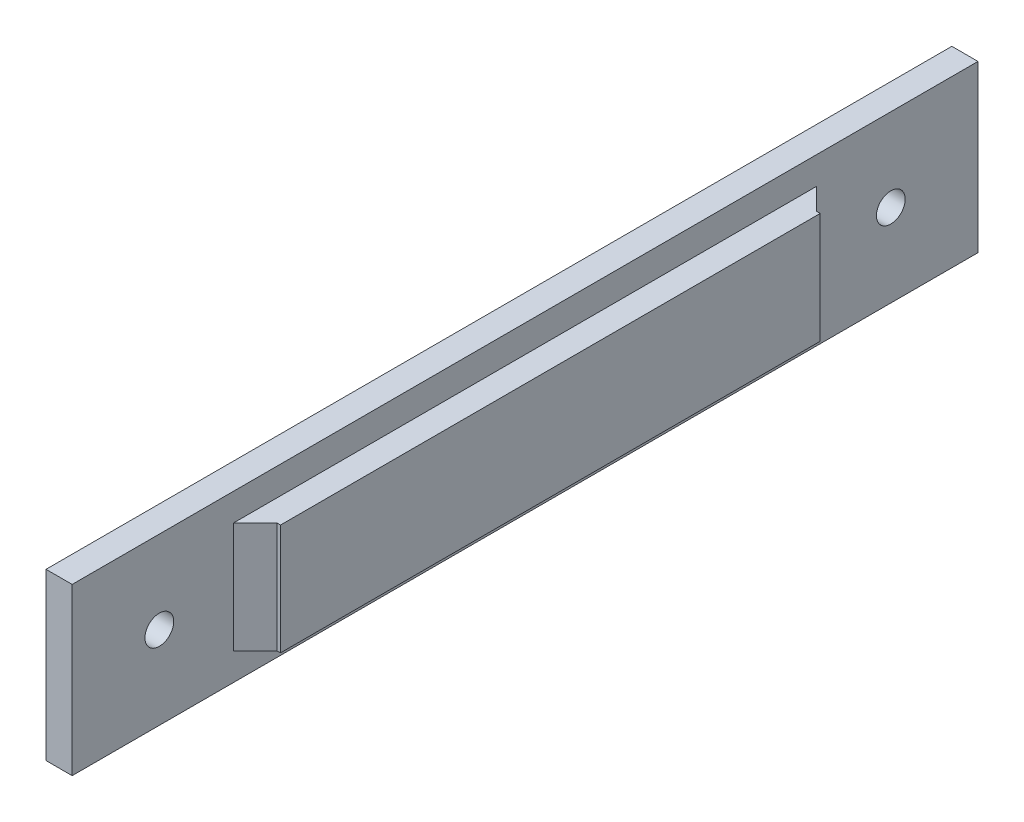
ISO-10303-21;
HEADER;
FILE_DESCRIPTION(('STEP AP214'),'2;1');
FILE_NAME('part.step','',(''),(''),'','','');
FILE_SCHEMA(('AUTOMOTIVE_DESIGN { 1 0 10303 214 1 1 1 1 }'));
ENDSEC;
DATA;
#1=APPLICATION_CONTEXT('core data for automotive mechanical design processes');
#2=APPLICATION_PROTOCOL_DEFINITION('international standard','automotive_design',2000,#1);
#3=PRODUCT_CONTEXT('',#1,'mechanical');
#4=PRODUCT('Part','Part','',(#3));
#5=PRODUCT_RELATED_PRODUCT_CATEGORY('part','',(#4));
#6=PRODUCT_DEFINITION_FORMATION('','',#4);
#7=PRODUCT_DEFINITION_CONTEXT('part definition',#1,'design');
#8=PRODUCT_DEFINITION('design','',#6,#7);
#9=PRODUCT_DEFINITION_SHAPE('','',#8);
#10=(LENGTH_UNIT() NAMED_UNIT(*) SI_UNIT(.MILLI.,.METRE.));
#11=(NAMED_UNIT(*) PLANE_ANGLE_UNIT() SI_UNIT($,.RADIAN.));
#12=(NAMED_UNIT(*) SI_UNIT($,.STERADIAN.) SOLID_ANGLE_UNIT());
#13=UNCERTAINTY_MEASURE_WITH_UNIT(LENGTH_MEASURE(1.E-05),#10,'distance_accuracy_value','');
#14=(GEOMETRIC_REPRESENTATION_CONTEXT(3) GLOBAL_UNCERTAINTY_ASSIGNED_CONTEXT((#13)) GLOBAL_UNIT_ASSIGNED_CONTEXT((#10,
#11,#12)) REPRESENTATION_CONTEXT('',''));
#15=CARTESIAN_POINT('',(0.,0.,0.));
#16=DIRECTION('',(0.,0.,1.));
#17=DIRECTION('',(1.,0.,0.));
#18=AXIS2_PLACEMENT_3D('',#15,#16,#17);
#19=CARTESIAN_POINT('',(0.,0.,103.9));
#20=DIRECTION('',(0.,0.,1.));
#21=DIRECTION('',(1.,0.,0.));
#22=AXIS2_PLACEMENT_3D('',#19,#20,#21);
#23=PLANE('',#22);
#24=DIRECTION('',(1.,0.,0.));
#25=VECTOR('',#24,1.);
#26=CARTESIAN_POINT('',(0.,-3.,103.9));
#27=LINE('',#26,#25);
#28=CARTESIAN_POINT('',(-3.,-3.,103.9));
#29=VERTEX_POINT('',#28);
#30=CARTESIAN_POINT('',(0.,-3.,103.9));
#31=VERTEX_POINT('',#30);
#32=EDGE_CURVE('E192',#29,#31,#27,.T.);
#33=ORIENTED_EDGE('',*,*,#32,.T.);
#34=DIRECTION('',(0.,-1.,0.));
#35=VECTOR('',#34,1.);
#36=CARTESIAN_POINT('',(0.,0.,103.9));
#37=LINE('',#36,#35);
#38=CARTESIAN_POINT('',(0.,16.,103.9));
#39=VERTEX_POINT('',#38);
#40=EDGE_CURVE('E185',#39,#31,#37,.T.);
#41=ORIENTED_EDGE('',*,*,#40,.F.);
#42=DIRECTION('',(-1.,0.,0.));
#43=VECTOR('',#42,1.);
#44=CARTESIAN_POINT('',(0.,16.,103.9));
#45=LINE('',#44,#43);
#46=CARTESIAN_POINT('',(-3.,16.,103.9));
#47=VERTEX_POINT('',#46);
#48=EDGE_CURVE('E196',#39,#47,#45,.T.);
#49=ORIENTED_EDGE('',*,*,#48,.T.);
#50=DIRECTION('',(0.,-1.,0.));
#51=VECTOR('',#50,1.);
#52=CARTESIAN_POINT('',(-3.,0.,103.9));
#53=LINE('',#52,#51);
#54=EDGE_CURVE('E189',#47,#29,#53,.T.);
#55=ORIENTED_EDGE('',*,*,#54,.T.);
#56=EDGE_LOOP('',(#33,#41,#49,#55));
#57=FACE_BOUND('',#56,.T.);
#58=ADVANCED_FACE('F62',(#57),#23,.T.);
#59=CARTESIAN_POINT('',(0.,0.,0.));
#60=DIRECTION('',(0.,0.,1.));
#61=DIRECTION('',(1.,0.,0.));
#62=AXIS2_PLACEMENT_3D('',#59,#60,#61);
#63=PLANE('',#62);
#64=DIRECTION('',(0.,-1.,0.));
#65=VECTOR('',#64,1.);
#66=CARTESIAN_POINT('',(0.,0.,0.));
#67=LINE('',#66,#65);
#68=CARTESIAN_POINT('',(0.,16.,0.));
#69=VERTEX_POINT('',#68);
#70=CARTESIAN_POINT('',(0.,-3.,0.));
#71=VERTEX_POINT('',#70);
#72=EDGE_CURVE('E184',#69,#71,#67,.T.);
#73=ORIENTED_EDGE('',*,*,#72,.T.);
#74=DIRECTION('',(1.,0.,0.));
#75=VECTOR('',#74,1.);
#76=CARTESIAN_POINT('',(0.,-3.,0.));
#77=LINE('',#76,#75);
#78=CARTESIAN_POINT('',(-3.,-3.,0.));
#79=VERTEX_POINT('',#78);
#80=EDGE_CURVE('E201',#79,#71,#77,.T.);
#81=ORIENTED_EDGE('',*,*,#80,.F.);
#82=DIRECTION('',(0.,-1.,0.));
#83=VECTOR('',#82,1.);
#84=CARTESIAN_POINT('',(-3.,0.,0.));
#85=LINE('',#84,#83);
#86=CARTESIAN_POINT('',(-3.,16.,0.));
#87=VERTEX_POINT('',#86);
#88=EDGE_CURVE('E187',#87,#79,#85,.T.);
#89=ORIENTED_EDGE('',*,*,#88,.F.);
#90=DIRECTION('',(-1.,0.,0.));
#91=VECTOR('',#90,1.);
#92=CARTESIAN_POINT('',(0.,16.,0.));
#93=LINE('',#92,#91);
#94=EDGE_CURVE('E193',#69,#87,#93,.T.);
#95=ORIENTED_EDGE('',*,*,#94,.F.);
#96=EDGE_LOOP('',(#73,#81,#89,#95));
#97=FACE_BOUND('',#96,.T.);
#98=ADVANCED_FACE('F253',(#97),#63,.F.);
#99=CARTESIAN_POINT('',(0.,-3.,103.9));
#100=DIRECTION('',(0.,1.,0.));
#101=DIRECTION('',(0.,0.,1.));
#102=AXIS2_PLACEMENT_3D('',#99,#100,#101);
#103=PLANE('',#102);
#104=DIRECTION('',(0.,0.,-1.));
#105=VECTOR('',#104,1.);
#106=CARTESIAN_POINT('',(0.,-3.,103.9));
#107=LINE('',#106,#105);
#108=EDGE_CURVE('E161',#31,#71,#107,.T.);
#109=ORIENTED_EDGE('',*,*,#108,.F.);
#110=ORIENTED_EDGE('',*,*,#32,.F.);
#111=DIRECTION('',(0.,0.,-1.));
#112=VECTOR('',#111,1.);
#113=CARTESIAN_POINT('',(-3.,-3.,103.9));
#114=LINE('',#113,#112);
#115=EDGE_CURVE('E207',#29,#79,#114,.T.);
#116=ORIENTED_EDGE('',*,*,#115,.T.);
#117=ORIENTED_EDGE('',*,*,#80,.T.);
#118=EDGE_LOOP('',(#109,#110,#116,#117));
#119=FACE_BOUND('',#118,.T.);
#120=ADVANCED_FACE('F259',(#119),#103,.F.);
#121=CARTESIAN_POINT('',(0.,16.,103.9));
#122=DIRECTION('',(0.,-1.,0.));
#123=DIRECTION('',(0.,0.,-1.));
#124=AXIS2_PLACEMENT_3D('',#121,#122,#123);
#125=PLANE('',#124);
#126=DIRECTION('',(0.,0.,1.));
#127=VECTOR('',#126,1.);
#128=CARTESIAN_POINT('',(0.,16.,103.9));
#129=LINE('',#128,#127);
#130=EDGE_CURVE('E164',#69,#39,#129,.T.);
#131=ORIENTED_EDGE('',*,*,#130,.F.);
#132=ORIENTED_EDGE('',*,*,#94,.T.);
#133=DIRECTION('',(0.,0.,-1.));
#134=VECTOR('',#133,1.);
#135=CARTESIAN_POINT('',(-3.,16.,103.9));
#136=LINE('',#135,#134);
#137=EDGE_CURVE('E198',#47,#87,#136,.T.);
#138=ORIENTED_EDGE('',*,*,#137,.F.);
#139=ORIENTED_EDGE('',*,*,#48,.F.);
#140=EDGE_LOOP('',(#131,#132,#138,#139));
#141=FACE_BOUND('',#140,.T.);
#142=ADVANCED_FACE('F265',(#141),#125,.F.);
#143=CARTESIAN_POINT('',(-3.,0.,103.9));
#144=DIRECTION('',(1.,0.,0.));
#145=DIRECTION('',(0.,0.,-1.));
#146=AXIS2_PLACEMENT_3D('',#143,#144,#145);
#147=PLANE('',#146);
#148=CARTESIAN_POINT('',(-3.,6.5,10.));
#149=DIRECTION('',(-1.,0.,0.));
#150=DIRECTION('',(0.,0.,1.));
#151=AXIS2_PLACEMENT_3D('',#148,#149,#150);
#152=CIRCLE('',#151,1.65);
#153=CARTESIAN_POINT('',(-3.,6.5,11.65));
#154=VERTEX_POINT('',#153);
#155=EDGE_CURVE('E173',#154,#154,#152,.T.);
#156=ORIENTED_EDGE('',*,*,#155,.F.);
#157=EDGE_LOOP('',(#156));
#158=FACE_BOUND('',#157,.T.);
#159=CARTESIAN_POINT('',(-3.,6.5,93.9));
#160=DIRECTION('',(-1.,0.,0.));
#161=DIRECTION('',(0.,0.,1.));
#162=AXIS2_PLACEMENT_3D('',#159,#160,#161);
#163=CIRCLE('',#162,1.65);
#164=CARTESIAN_POINT('',(-3.,6.5,95.55));
#165=VERTEX_POINT('',#164);
#166=EDGE_CURVE('E172',#165,#165,#163,.T.);
#167=ORIENTED_EDGE('',*,*,#166,.F.);
#168=EDGE_LOOP('',(#167));
#169=FACE_BOUND('',#168,.T.);
#170=ORIENTED_EDGE('',*,*,#88,.T.);
#171=ORIENTED_EDGE('',*,*,#115,.F.);
#172=ORIENTED_EDGE('',*,*,#54,.F.);
#173=ORIENTED_EDGE('',*,*,#137,.T.);
#174=EDGE_LOOP('',(#170,#171,#172,#173));
#175=FACE_BOUND('',#174,.T.);
#176=ADVANCED_FACE('F268',(#158,#169,#175),#147,.F.);
#177=CARTESIAN_POINT('',(0.,0.,103.9));
#178=DIRECTION('',(1.,0.,0.));
#179=DIRECTION('',(0.,0.,-1.));
#180=AXIS2_PLACEMENT_3D('',#177,#178,#179);
#181=PLANE('',#180);
#182=DIRECTION('',(0.,0.,1.));
#183=VECTOR('',#182,1.);
#184=CARTESIAN_POINT('',(0.,12.85,82.9));
#185=LINE('',#184,#183);
#186=CARTESIAN_POINT('',(0.,12.85,18.5));
#187=VERTEX_POINT('',#186);
#188=CARTESIAN_POINT('',(0.,12.85,85.4));
#189=VERTEX_POINT('',#188);
#190=EDGE_CURVE('E157',#187,#189,#185,.T.);
#191=ORIENTED_EDGE('',*,*,#190,.F.);
#192=DIRECTION('',(0.,-1.,0.));
#193=VECTOR('',#192,1.);
#194=CARTESIAN_POINT('',(0.,0.,18.5));
#195=LINE('',#194,#193);
#196=CARTESIAN_POINT('',(0.,0.150000000000021,18.5));
#197=VERTEX_POINT('',#196);
#198=EDGE_CURVE('E216',#187,#197,#195,.T.);
#199=ORIENTED_EDGE('',*,*,#198,.T.);
#200=DIRECTION('',(0.,0.,-1.));
#201=VECTOR('',#200,1.);
#202=CARTESIAN_POINT('',(0.,0.149999999999978,82.9));
#203=LINE('',#202,#201);
#204=CARTESIAN_POINT('',(0.,0.149999999999977,85.4));
#205=VERTEX_POINT('',#204);
#206=EDGE_CURVE('E224',#205,#197,#203,.T.);
#207=ORIENTED_EDGE('',*,*,#206,.F.);
#208=DIRECTION('',(0.,1.,0.));
#209=VECTOR('',#208,1.);
#210=CARTESIAN_POINT('',(0.,0.,85.4));
#211=LINE('',#210,#209);
#212=EDGE_CURVE('E213',#205,#189,#211,.T.);
#213=ORIENTED_EDGE('',*,*,#212,.T.);
#214=EDGE_LOOP('',(#191,#199,#207,#213));
#215=FACE_BOUND('',#214,.T.);
#216=CARTESIAN_POINT('',(0.,6.5,10.));
#217=DIRECTION('',(1.,0.,0.));
#218=DIRECTION('',(0.,0.,-1.));
#219=AXIS2_PLACEMENT_3D('',#216,#217,#218);
#220=CIRCLE('',#219,1.65);
#221=CARTESIAN_POINT('',(0.,6.5,11.65));
#222=VERTEX_POINT('',#221);
#223=EDGE_CURVE('E181',#222,#222,#220,.T.);
#224=ORIENTED_EDGE('',*,*,#223,.F.);
#225=EDGE_LOOP('',(#224));
#226=FACE_BOUND('',#225,.T.);
#227=CARTESIAN_POINT('',(0.,6.5,93.9));
#228=DIRECTION('',(1.,0.,0.));
#229=DIRECTION('',(0.,0.,-1.));
#230=AXIS2_PLACEMENT_3D('',#227,#228,#229);
#231=CIRCLE('',#230,1.65);
#232=CARTESIAN_POINT('',(0.,6.5,95.55));
#233=VERTEX_POINT('',#232);
#234=EDGE_CURVE('E176',#233,#233,#231,.T.);
#235=ORIENTED_EDGE('',*,*,#234,.F.);
#236=EDGE_LOOP('',(#235));
#237=FACE_BOUND('',#236,.T.);
#238=ORIENTED_EDGE('',*,*,#72,.F.);
#239=ORIENTED_EDGE('',*,*,#130,.T.);
#240=ORIENTED_EDGE('',*,*,#40,.T.);
#241=ORIENTED_EDGE('',*,*,#108,.T.);
#242=EDGE_LOOP('',(#238,#239,#240,#241));
#243=FACE_BOUND('',#242,.T.);
#244=ADVANCED_FACE('F226',(#215,#226,#237,#243),#181,.T.);
#245=CARTESIAN_POINT('',(27.,6.5,93.9));
#246=DIRECTION('',(-1.,0.,0.));
#247=DIRECTION('',(0.,0.,1.));
#248=AXIS2_PLACEMENT_3D('',#245,#246,#247);
#249=CYLINDRICAL_SURFACE('',#248,1.65);
#250=CARTESIAN_POINT('',(0.,6.5,95.55));
#251=CARTESIAN_POINT('',(-0.0312500000000035,6.5,95.55));
#252=CARTESIAN_POINT('',(-0.0625000000000035,6.5,95.55));
#253=CARTESIAN_POINT('',(-0.125000000000004,6.5,95.55));
#254=CARTESIAN_POINT('',(-0.156250000000004,6.5,95.55));
#255=CARTESIAN_POINT('',(-0.218750000000004,6.5,95.55));
#256=CARTESIAN_POINT('',(-0.250000000000004,6.5,95.55));
#257=CARTESIAN_POINT('',(-0.312500000000004,6.5,95.55));
#258=CARTESIAN_POINT('',(-0.343750000000004,6.5,95.55));
#259=CARTESIAN_POINT('',(-0.406250000000004,6.5,95.55));
#260=CARTESIAN_POINT('',(-0.437500000000004,6.5,95.55));
#261=CARTESIAN_POINT('',(-0.500000000000004,6.5,95.55));
#262=CARTESIAN_POINT('',(-0.531250000000004,6.5,95.55));
#263=CARTESIAN_POINT('',(-0.593750000000004,6.5,95.55));
#264=CARTESIAN_POINT('',(-0.625000000000004,6.5,95.55));
#265=CARTESIAN_POINT('',(-0.687500000000004,6.5,95.55));
#266=CARTESIAN_POINT('',(-0.718750000000004,6.5,95.55));
#267=CARTESIAN_POINT('',(-0.781250000000003,6.5,95.55));
#268=CARTESIAN_POINT('',(-0.812500000000002,6.5,95.55));
#269=CARTESIAN_POINT('',(-0.875000000000001,6.5,95.55));
#270=CARTESIAN_POINT('',(-0.906250000000001,6.5,95.55));
#271=CARTESIAN_POINT('',(-0.968750000000001,6.5,95.55));
#272=CARTESIAN_POINT('',(-1.,6.5,95.55));
#273=CARTESIAN_POINT('',(-1.0625,6.5,95.55));
#274=CARTESIAN_POINT('',(-1.09375,6.5,95.55));
#275=CARTESIAN_POINT('',(-1.15625,6.5,95.55));
#276=CARTESIAN_POINT('',(-1.1875,6.5,95.55));
#277=CARTESIAN_POINT('',(-1.25,6.5,95.55));
#278=CARTESIAN_POINT('',(-1.28125,6.5,95.55));
#279=CARTESIAN_POINT('',(-1.34375,6.5,95.55));
#280=CARTESIAN_POINT('',(-1.375,6.5,95.55));
#281=CARTESIAN_POINT('',(-1.4375,6.5,95.55));
#282=CARTESIAN_POINT('',(-1.46875,6.5,95.55));
#283=CARTESIAN_POINT('',(-1.53125,6.5,95.55));
#284=CARTESIAN_POINT('',(-1.5625,6.5,95.55));
#285=CARTESIAN_POINT('',(-1.625,6.5,95.55));
#286=CARTESIAN_POINT('',(-1.65625,6.5,95.55));
#287=CARTESIAN_POINT('',(-1.71875,6.5,95.55));
#288=CARTESIAN_POINT('',(-1.75,6.5,95.55));
#289=CARTESIAN_POINT('',(-1.8125,6.5,95.55));
#290=CARTESIAN_POINT('',(-1.84375,6.5,95.55));
#291=CARTESIAN_POINT('',(-1.90625,6.5,95.55));
#292=CARTESIAN_POINT('',(-1.9375,6.5,95.55));
#293=CARTESIAN_POINT('',(-2.,6.5,95.55));
#294=CARTESIAN_POINT('',(-2.03125,6.5,95.55));
#295=CARTESIAN_POINT('',(-2.09375,6.5,95.55));
#296=CARTESIAN_POINT('',(-2.125,6.5,95.55));
#297=CARTESIAN_POINT('',(-2.1875,6.5,95.55));
#298=CARTESIAN_POINT('',(-2.21875,6.5,95.55));
#299=CARTESIAN_POINT('',(-2.28125,6.5,95.55));
#300=CARTESIAN_POINT('',(-2.3125,6.5,95.55));
#301=CARTESIAN_POINT('',(-2.375,6.5,95.55));
#302=CARTESIAN_POINT('',(-2.40625,6.5,95.55));
#303=CARTESIAN_POINT('',(-2.46875,6.5,95.55));
#304=CARTESIAN_POINT('',(-2.5,6.5,95.55));
#305=CARTESIAN_POINT('',(-2.5625,6.5,95.55));
#306=CARTESIAN_POINT('',(-2.59375,6.5,95.55));
#307=CARTESIAN_POINT('',(-2.65625,6.5,95.55));
#308=CARTESIAN_POINT('',(-2.6875,6.5,95.55));
#309=CARTESIAN_POINT('',(-2.75,6.5,95.55));
#310=CARTESIAN_POINT('',(-2.78125,6.5,95.55));
#311=CARTESIAN_POINT('',(-2.84375,6.5,95.55));
#312=CARTESIAN_POINT('',(-2.875,6.5,95.55));
#313=CARTESIAN_POINT('',(-2.9375,6.5,95.55));
#314=CARTESIAN_POINT('',(-2.96875,6.5,95.55));
#315=CARTESIAN_POINT('',(-3.,6.5,95.55));
#316=B_SPLINE_CURVE_WITH_KNOTS('',3,(#250,#251,#252,#253,#254,#255,#256,#257,#258,#259,#260,
#261,#262,#263,#264,#265,#266,#267,#268,#269,#270,#271,#272,#273,#274,#275,#276,#277,#278,#279,
#280,#281,#282,#283,#284,#285,#286,#287,#288,#289,#290,#291,#292,#293,#294,#295,#296,#297,#298,
#299,#300,#301,#302,#303,#304,#305,#306,#307,#308,#309,#310,#311,#312,#313,#314,#315),
.UNSPECIFIED.,.F.,.F.,(4,2,2,2,2,2,2,2,2,2,2,2,2,2,2,2,2,2,2,2,2,2,2,2,2,2,2,2,2,2,2,2,4),(0.,
0.0937500000000001,0.1875,0.28125,0.375,0.46875,0.5625,0.656250000000001,0.750000000000001,
0.843749999999997,0.937499999999997,1.03125,1.125,1.21875,1.3125,1.40625,1.5,1.59375,1.6875,
1.78125,1.875,1.96875,2.0625,2.15625,2.25,2.34375,2.4375,2.53125,2.625,2.71875,2.8125,2.90625,
3.),.UNSPECIFIED.);
#317=EDGE_CURVE('BSEAM277',#233,#165,#316,.T.);
#318=ORIENTED_EDGE('',*,*,#234,.T.);
#319=ORIENTED_EDGE('',*,*,#166,.T.);
#320=ORIENTED_EDGE('',*,*,#317,.T.);
#321=ORIENTED_EDGE('',*,*,#317,.F.);
#322=EDGE_LOOP('',(#318,#320,#319,#321));
#323=FACE_BOUND('',#322,.T.);
#324=ADVANCED_FACE('F277',(#323),#249,.F.);
#325=CARTESIAN_POINT('',(27.,6.5,10.));
#326=DIRECTION('',(-1.,0.,0.));
#327=DIRECTION('',(0.,0.,1.));
#328=AXIS2_PLACEMENT_3D('',#325,#326,#327);
#329=CYLINDRICAL_SURFACE('',#328,1.65);
#330=CARTESIAN_POINT('',(0.,6.5,11.65));
#331=CARTESIAN_POINT('',(-0.0312500000000035,6.5,11.65));
#332=CARTESIAN_POINT('',(-0.0625000000000035,6.5,11.65));
#333=CARTESIAN_POINT('',(-0.125000000000004,6.5,11.65));
#334=CARTESIAN_POINT('',(-0.156250000000004,6.5,11.65));
#335=CARTESIAN_POINT('',(-0.218750000000004,6.5,11.65));
#336=CARTESIAN_POINT('',(-0.250000000000004,6.5,11.65));
#337=CARTESIAN_POINT('',(-0.312500000000004,6.5,11.65));
#338=CARTESIAN_POINT('',(-0.343750000000004,6.5,11.65));
#339=CARTESIAN_POINT('',(-0.406250000000004,6.5,11.65));
#340=CARTESIAN_POINT('',(-0.437500000000004,6.5,11.65));
#341=CARTESIAN_POINT('',(-0.500000000000004,6.5,11.65));
#342=CARTESIAN_POINT('',(-0.531250000000004,6.5,11.65));
#343=CARTESIAN_POINT('',(-0.593750000000004,6.5,11.65));
#344=CARTESIAN_POINT('',(-0.625000000000004,6.5,11.65));
#345=CARTESIAN_POINT('',(-0.687500000000004,6.5,11.65));
#346=CARTESIAN_POINT('',(-0.718750000000004,6.5,11.65));
#347=CARTESIAN_POINT('',(-0.781250000000003,6.5,11.65));
#348=CARTESIAN_POINT('',(-0.812500000000002,6.5,11.65));
#349=CARTESIAN_POINT('',(-0.875000000000001,6.5,11.65));
#350=CARTESIAN_POINT('',(-0.906250000000001,6.5,11.65));
#351=CARTESIAN_POINT('',(-0.968750000000001,6.5,11.65));
#352=CARTESIAN_POINT('',(-1.,6.5,11.65));
#353=CARTESIAN_POINT('',(-1.0625,6.5,11.65));
#354=CARTESIAN_POINT('',(-1.09375,6.5,11.65));
#355=CARTESIAN_POINT('',(-1.15625,6.5,11.65));
#356=CARTESIAN_POINT('',(-1.1875,6.5,11.65));
#357=CARTESIAN_POINT('',(-1.25,6.5,11.65));
#358=CARTESIAN_POINT('',(-1.28125,6.5,11.65));
#359=CARTESIAN_POINT('',(-1.34375,6.5,11.65));
#360=CARTESIAN_POINT('',(-1.375,6.5,11.65));
#361=CARTESIAN_POINT('',(-1.4375,6.5,11.65));
#362=CARTESIAN_POINT('',(-1.46875,6.5,11.65));
#363=CARTESIAN_POINT('',(-1.53125,6.5,11.65));
#364=CARTESIAN_POINT('',(-1.5625,6.5,11.65));
#365=CARTESIAN_POINT('',(-1.625,6.5,11.65));
#366=CARTESIAN_POINT('',(-1.65625,6.5,11.65));
#367=CARTESIAN_POINT('',(-1.71875,6.5,11.65));
#368=CARTESIAN_POINT('',(-1.75,6.5,11.65));
#369=CARTESIAN_POINT('',(-1.8125,6.5,11.65));
#370=CARTESIAN_POINT('',(-1.84375,6.5,11.65));
#371=CARTESIAN_POINT('',(-1.90625,6.5,11.65));
#372=CARTESIAN_POINT('',(-1.9375,6.5,11.65));
#373=CARTESIAN_POINT('',(-2.,6.5,11.65));
#374=CARTESIAN_POINT('',(-2.03125,6.5,11.65));
#375=CARTESIAN_POINT('',(-2.09375,6.5,11.65));
#376=CARTESIAN_POINT('',(-2.125,6.5,11.65));
#377=CARTESIAN_POINT('',(-2.1875,6.5,11.65));
#378=CARTESIAN_POINT('',(-2.21875,6.5,11.65));
#379=CARTESIAN_POINT('',(-2.28125,6.5,11.65));
#380=CARTESIAN_POINT('',(-2.3125,6.5,11.65));
#381=CARTESIAN_POINT('',(-2.375,6.5,11.65));
#382=CARTESIAN_POINT('',(-2.40625,6.5,11.65));
#383=CARTESIAN_POINT('',(-2.46875,6.5,11.65));
#384=CARTESIAN_POINT('',(-2.5,6.5,11.65));
#385=CARTESIAN_POINT('',(-2.5625,6.5,11.65));
#386=CARTESIAN_POINT('',(-2.59375,6.5,11.65));
#387=CARTESIAN_POINT('',(-2.65625,6.5,11.65));
#388=CARTESIAN_POINT('',(-2.6875,6.5,11.65));
#389=CARTESIAN_POINT('',(-2.75,6.5,11.65));
#390=CARTESIAN_POINT('',(-2.78125,6.5,11.65));
#391=CARTESIAN_POINT('',(-2.84375,6.5,11.65));
#392=CARTESIAN_POINT('',(-2.875,6.5,11.65));
#393=CARTESIAN_POINT('',(-2.9375,6.5,11.65));
#394=CARTESIAN_POINT('',(-2.96875,6.5,11.65));
#395=CARTESIAN_POINT('',(-3.,6.5,11.65));
#396=B_SPLINE_CURVE_WITH_KNOTS('',3,(#330,#331,#332,#333,#334,#335,#336,#337,#338,#339,#340,
#341,#342,#343,#344,#345,#346,#347,#348,#349,#350,#351,#352,#353,#354,#355,#356,#357,#358,#359,
#360,#361,#362,#363,#364,#365,#366,#367,#368,#369,#370,#371,#372,#373,#374,#375,#376,#377,#378,
#379,#380,#381,#382,#383,#384,#385,#386,#387,#388,#389,#390,#391,#392,#393,#394,#395),
.UNSPECIFIED.,.F.,.F.,(4,2,2,2,2,2,2,2,2,2,2,2,2,2,2,2,2,2,2,2,2,2,2,2,2,2,2,2,2,2,2,2,4),(0.,
0.0937500000000001,0.1875,0.28125,0.375,0.46875,0.5625,0.656250000000001,0.750000000000001,
0.843749999999997,0.937499999999997,1.03125,1.125,1.21875,1.3125,1.40625,1.5,1.59375,1.6875,
1.78125,1.875,1.96875,2.0625,2.15625,2.25,2.34375,2.4375,2.53125,2.625,2.71875,2.8125,2.90625,
3.),.UNSPECIFIED.);
#397=EDGE_CURVE('BSEAM293',#222,#154,#396,.T.);
#398=ORIENTED_EDGE('',*,*,#223,.T.);
#399=ORIENTED_EDGE('',*,*,#155,.T.);
#400=ORIENTED_EDGE('',*,*,#397,.T.);
#401=ORIENTED_EDGE('',*,*,#397,.F.);
#402=EDGE_LOOP('',(#398,#400,#399,#401));
#403=FACE_BOUND('',#402,.T.);
#404=ADVANCED_FACE('F293',(#403),#329,.F.);
#405=CARTESIAN_POINT('',(2.9,12.85,82.9));
#406=DIRECTION('',(0.,0.,-1.));
#407=DIRECTION('',(-1.,0.,0.));
#408=AXIS2_PLACEMENT_3D('',#405,#406,#407);
#409=PLANE('',#408);
#410=DIRECTION('',(-1.,0.,0.));
#411=VECTOR('',#410,1.);
#412=CARTESIAN_POINT('',(2.9,12.85,82.9));
#413=LINE('',#412,#411);
#414=CARTESIAN_POINT('',(2.9,12.85,82.9));
#415=VERTEX_POINT('',#414);
#416=CARTESIAN_POINT('',(2.50000000000002,12.85,82.9));
#417=VERTEX_POINT('',#416);
#418=EDGE_CURVE('E235',#415,#417,#413,.T.);
#419=ORIENTED_EDGE('',*,*,#418,.T.);
#420=DIRECTION('',(0.,-1.,0.));
#421=VECTOR('',#420,1.);
#422=CARTESIAN_POINT('',(2.50000000000002,12.85,82.9));
#423=LINE('',#422,#421);
#424=CARTESIAN_POINT('',(2.50000000000002,0.149999999999978,82.9));
#425=VERTEX_POINT('',#424);
#426=EDGE_CURVE('E160',#417,#425,#423,.T.);
#427=ORIENTED_EDGE('',*,*,#426,.T.);
#428=DIRECTION('',(-1.,0.,0.));
#429=VECTOR('',#428,1.);
#430=CARTESIAN_POINT('',(2.9,0.149999999999978,82.9));
#431=LINE('',#430,#429);
#432=CARTESIAN_POINT('',(2.9,0.149999999999978,82.9));
#433=VERTEX_POINT('',#432);
#434=EDGE_CURVE('E144',#433,#425,#431,.T.);
#435=ORIENTED_EDGE('',*,*,#434,.F.);
#436=DIRECTION('',(0.,-1.,0.));
#437=VECTOR('',#436,1.);
#438=CARTESIAN_POINT('',(2.9,12.85,82.9));
#439=LINE('',#438,#437);
#440=EDGE_CURVE('E150',#415,#433,#439,.T.);
#441=ORIENTED_EDGE('',*,*,#440,.F.);
#442=EDGE_LOOP('',(#419,#427,#435,#441));
#443=FACE_BOUND('',#442,.T.);
#444=ADVANCED_FACE('F159',(#443),#409,.F.);
#445=CARTESIAN_POINT('',(2.9,0.149999999999978,82.9));
#446=DIRECTION('',(0.,1.,0.));
#447=DIRECTION('',(0.,0.,1.));
#448=AXIS2_PLACEMENT_3D('',#445,#446,#447);
#449=PLANE('',#448);
#450=ORIENTED_EDGE('',*,*,#206,.T.);
#451=DIRECTION('',(0.707106781186553,0.,0.707106781186542));
#452=VECTOR('',#451,1.);
#453=CARTESIAN_POINT('',(33.65,0.149999999999998,52.1499999999995));
#454=LINE('',#453,#452);
#455=CARTESIAN_POINT('',(2.50000000000002,0.150000000000019,21.));
#456=VERTEX_POINT('',#455);
#457=EDGE_CURVE('E223',#197,#456,#454,.T.);
#458=ORIENTED_EDGE('',*,*,#457,.T.);
#459=DIRECTION('',(-1.,0.,0.));
#460=VECTOR('',#459,1.);
#461=CARTESIAN_POINT('',(2.9,0.150000000000019,21.));
#462=LINE('',#461,#460);
#463=CARTESIAN_POINT('',(2.9,0.150000000000019,21.));
#464=VERTEX_POINT('',#463);
#465=EDGE_CURVE('E146',#464,#456,#462,.T.);
#466=ORIENTED_EDGE('',*,*,#465,.F.);
#467=DIRECTION('',(0.,0.,-1.));
#468=VECTOR('',#467,1.);
#469=CARTESIAN_POINT('',(2.9,0.149999999999978,82.9));
#470=LINE('',#469,#468);
#471=EDGE_CURVE('E140',#433,#464,#470,.T.);
#472=ORIENTED_EDGE('',*,*,#471,.F.);
#473=ORIENTED_EDGE('',*,*,#434,.T.);
#474=DIRECTION('',(-0.707106781186551,0.,0.707106781186544));
#475=VECTOR('',#474,1.);
#476=CARTESIAN_POINT('',(2.70000000000001,0.149999999999978,82.7));
#477=LINE('',#476,#475);
#478=EDGE_CURVE('E71',#425,#205,#477,.T.);
#479=ORIENTED_EDGE('',*,*,#478,.T.);
#480=EDGE_LOOP('',(#450,#458,#466,#472,#473,#479));
#481=FACE_BOUND('',#480,.T.);
#482=ADVANCED_FACE('F142',(#481),#449,.F.);
#483=CARTESIAN_POINT('',(2.9,12.85,21.));
#484=DIRECTION('',(0.,0.,1.));
#485=DIRECTION('',(0.,-1.,0.));
#486=AXIS2_PLACEMENT_3D('',#483,#484,#485);
#487=PLANE('',#486);
#488=ORIENTED_EDGE('',*,*,#465,.T.);
#489=DIRECTION('',(0.,1.,0.));
#490=VECTOR('',#489,1.);
#491=CARTESIAN_POINT('',(2.50000000000002,12.85,21.));
#492=LINE('',#491,#490);
#493=CARTESIAN_POINT('',(2.50000000000002,12.85,21.));
#494=VERTEX_POINT('',#493);
#495=EDGE_CURVE('E210',#456,#494,#492,.T.);
#496=ORIENTED_EDGE('',*,*,#495,.T.);
#497=DIRECTION('',(-1.,0.,0.));
#498=VECTOR('',#497,1.);
#499=CARTESIAN_POINT('',(2.9,12.85,21.));
#500=LINE('',#499,#498);
#501=CARTESIAN_POINT('',(2.9,12.85,21.));
#502=VERTEX_POINT('',#501);
#503=EDGE_CURVE('E166',#502,#494,#500,.T.);
#504=ORIENTED_EDGE('',*,*,#503,.F.);
#505=DIRECTION('',(0.,1.,0.));
#506=VECTOR('',#505,1.);
#507=CARTESIAN_POINT('',(2.9,12.85,21.));
#508=LINE('',#507,#506);
#509=EDGE_CURVE('E149',#464,#502,#508,.T.);
#510=ORIENTED_EDGE('',*,*,#509,.F.);
#511=EDGE_LOOP('',(#488,#496,#504,#510));
#512=FACE_BOUND('',#511,.T.);
#513=ADVANCED_FACE('F240',(#512),#487,.F.);
#514=CARTESIAN_POINT('',(2.9,12.85,82.9));
#515=DIRECTION('',(0.,-1.,0.));
#516=DIRECTION('',(0.,0.,-1.));
#517=AXIS2_PLACEMENT_3D('',#514,#515,#516);
#518=PLANE('',#517);
#519=ORIENTED_EDGE('',*,*,#190,.T.);
#520=DIRECTION('',(0.707106781186551,0.,-0.707106781186544));
#521=VECTOR('',#520,1.);
#522=CARTESIAN_POINT('',(2.70000000000001,12.85,82.7));
#523=LINE('',#522,#521);
#524=EDGE_CURVE('E12',#189,#417,#523,.T.);
#525=ORIENTED_EDGE('',*,*,#524,.T.);
#526=ORIENTED_EDGE('',*,*,#418,.F.);
#527=DIRECTION('',(0.,0.,1.));
#528=VECTOR('',#527,1.);
#529=CARTESIAN_POINT('',(2.9,12.85,82.9));
#530=LINE('',#529,#528);
#531=EDGE_CURVE('E155',#502,#415,#530,.T.);
#532=ORIENTED_EDGE('',*,*,#531,.F.);
#533=ORIENTED_EDGE('',*,*,#503,.T.);
#534=DIRECTION('',(-0.707106781186553,0.,-0.707106781186542));
#535=VECTOR('',#534,1.);
#536=CARTESIAN_POINT('',(33.65,12.85,52.1499999999995));
#537=LINE('',#536,#535);
#538=EDGE_CURVE('E220',#494,#187,#537,.T.);
#539=ORIENTED_EDGE('',*,*,#538,.T.);
#540=EDGE_LOOP('',(#519,#525,#526,#532,#533,#539));
#541=FACE_BOUND('',#540,.T.);
#542=ADVANCED_FACE('F238',(#541),#518,.F.);
#543=CARTESIAN_POINT('',(2.9,0.,0.));
#544=DIRECTION('',(1.,0.,0.));
#545=DIRECTION('',(0.,0.,-1.));
#546=AXIS2_PLACEMENT_3D('',#543,#544,#545);
#547=PLANE('',#546);
#548=ORIENTED_EDGE('',*,*,#440,.T.);
#549=ORIENTED_EDGE('',*,*,#471,.T.);
#550=ORIENTED_EDGE('',*,*,#509,.T.);
#551=ORIENTED_EDGE('',*,*,#531,.T.);
#552=EDGE_LOOP('',(#548,#549,#550,#551));
#553=FACE_BOUND('',#552,.T.);
#554=ADVANCED_FACE('F153',(#553),#547,.T.);
#555=CARTESIAN_POINT('',(2.50000000000002,12.85,21.));
#556=DIRECTION('',(-0.707106781186542,0.,0.707106781186553));
#557=DIRECTION('',(0.,1.,0.));
#558=AXIS2_PLACEMENT_3D('',#555,#556,#557);
#559=PLANE('',#558);
#560=ORIENTED_EDGE('',*,*,#457,.F.);
#561=ORIENTED_EDGE('',*,*,#198,.F.);
#562=ORIENTED_EDGE('',*,*,#538,.F.);
#563=ORIENTED_EDGE('',*,*,#495,.F.);
#564=EDGE_LOOP('',(#560,#561,#562,#563));
#565=FACE_BOUND('',#564,.T.);
#566=ADVANCED_FACE('F243',(#565),#559,.F.);
#567=CARTESIAN_POINT('',(2.50000000000002,12.85,82.9));
#568=DIRECTION('',(-0.707106781186544,0.,-0.707106781186551));
#569=DIRECTION('',(0.,-1.,0.));
#570=AXIS2_PLACEMENT_3D('',#567,#568,#569);
#571=PLANE('',#570);
#572=ORIENTED_EDGE('',*,*,#524,.F.);
#573=ORIENTED_EDGE('',*,*,#212,.F.);
#574=ORIENTED_EDGE('',*,*,#478,.F.);
#575=ORIENTED_EDGE('',*,*,#426,.F.);
#576=EDGE_LOOP('',(#572,#573,#574,#575));
#577=FACE_BOUND('',#576,.T.);
#578=ADVANCED_FACE('F65',(#577),#571,.F.);
#579=CLOSED_SHELL('',(#58,#98,#120,#142,#176,#244,#324,#404,#444,#482,#513,#542,#554,#566,#578));
#580=MANIFOLD_SOLID_BREP('B2',#579);
#581=ADVANCED_BREP_SHAPE_REPRESENTATION('',(#18,#580),#14);
#582=SHAPE_DEFINITION_REPRESENTATION(#9,#581);
ENDSEC;
END-ISO-10303-21;
